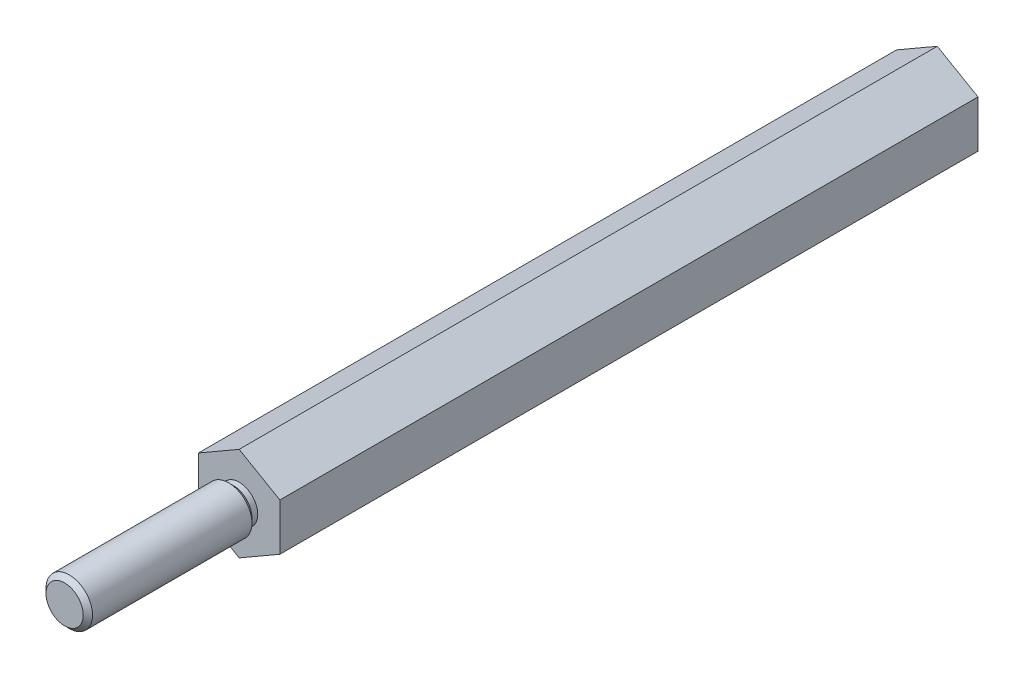
ISO-10303-21;
HEADER;
FILE_DESCRIPTION(('STEP AP214'),'2;1');
FILE_NAME('part.step','',(''),(''),'','','');
FILE_SCHEMA(('AUTOMOTIVE_DESIGN { 1 0 10303 214 1 1 1 1 }'));
ENDSEC;
DATA;
#1=APPLICATION_CONTEXT('core data for automotive mechanical design processes');
#2=APPLICATION_PROTOCOL_DEFINITION('international standard','automotive_design',2000,#1);
#3=PRODUCT_CONTEXT('',#1,'mechanical');
#4=PRODUCT('Part','Part','',(#3));
#5=PRODUCT_RELATED_PRODUCT_CATEGORY('part','',(#4));
#6=PRODUCT_DEFINITION_FORMATION('','',#4);
#7=PRODUCT_DEFINITION_CONTEXT('part definition',#1,'design');
#8=PRODUCT_DEFINITION('design','',#6,#7);
#9=PRODUCT_DEFINITION_SHAPE('','',#8);
#10=(LENGTH_UNIT() NAMED_UNIT(*) SI_UNIT(.MILLI.,.METRE.));
#11=(NAMED_UNIT(*) PLANE_ANGLE_UNIT() SI_UNIT($,.RADIAN.));
#12=(NAMED_UNIT(*) SI_UNIT($,.STERADIAN.) SOLID_ANGLE_UNIT());
#13=UNCERTAINTY_MEASURE_WITH_UNIT(LENGTH_MEASURE(1.E-05),#10,'distance_accuracy_value','');
#14=(GEOMETRIC_REPRESENTATION_CONTEXT(3) GLOBAL_UNCERTAINTY_ASSIGNED_CONTEXT((#13)) GLOBAL_UNIT_ASSIGNED_CONTEXT((#10,
#11,#12)) REPRESENTATION_CONTEXT('',''));
#15=CARTESIAN_POINT('',(0.,0.,0.));
#16=DIRECTION('',(0.,0.,1.));
#17=DIRECTION('',(1.,0.,0.));
#18=AXIS2_PLACEMENT_3D('',#15,#16,#17);
#19=CARTESIAN_POINT('',(0.,4.04145188432737,60.));
#20=DIRECTION('',(0.,0.,1.));
#21=DIRECTION('',(1.,0.,0.));
#22=AXIS2_PLACEMENT_3D('',#19,#20,#21);
#23=PLANE('',#22);
#24=DIRECTION('',(-0.866025403784438,0.5,0.));
#25=VECTOR('',#24,1.);
#26=CARTESIAN_POINT('',(3.49999999999999,2.02072594216368,60.));
#27=LINE('',#26,#25);
#28=CARTESIAN_POINT('',(3.49999999999999,2.02072594216368,60.));
#29=VERTEX_POINT('',#28);
#30=CARTESIAN_POINT('',(0.,4.04145188432737,60.));
#31=VERTEX_POINT('',#30);
#32=EDGE_CURVE('E129',#29,#31,#27,.T.);
#33=ORIENTED_EDGE('',*,*,#32,.T.);
#34=DIRECTION('',(-0.866025403784438,-0.5,0.));
#35=VECTOR('',#34,1.);
#36=CARTESIAN_POINT('',(0.,4.04145188432737,60.));
#37=LINE('',#36,#35);
#38=CARTESIAN_POINT('',(-3.5,2.02072594216368,60.));
#39=VERTEX_POINT('',#38);
#40=EDGE_CURVE('E86',#31,#39,#37,.T.);
#41=ORIENTED_EDGE('',*,*,#40,.T.);
#42=DIRECTION('',(0.,-1.,0.));
#43=VECTOR('',#42,1.);
#44=CARTESIAN_POINT('',(-3.5,2.02072594216368,60.));
#45=LINE('',#44,#43);
#46=CARTESIAN_POINT('',(-3.5,-2.0207259421637,60.));
#47=VERTEX_POINT('',#46);
#48=EDGE_CURVE('E100',#39,#47,#45,.T.);
#49=ORIENTED_EDGE('',*,*,#48,.T.);
#50=DIRECTION('',(0.866025403784438,-0.5,0.));
#51=VECTOR('',#50,1.);
#52=CARTESIAN_POINT('',(-3.5,-2.0207259421637,60.));
#53=LINE('',#52,#51);
#54=CARTESIAN_POINT('',(0.,-4.04145188432739,60.));
#55=VERTEX_POINT('',#54);
#56=EDGE_CURVE('E94',#47,#55,#53,.T.);
#57=ORIENTED_EDGE('',*,*,#56,.T.);
#58=DIRECTION('',(0.866025403784439,0.5,0.));
#59=VECTOR('',#58,1.);
#60=CARTESIAN_POINT('',(0.,-4.04145188432739,60.));
#61=LINE('',#60,#59);
#62=CARTESIAN_POINT('',(3.49999999999999,-2.0207259421637,60.));
#63=VERTEX_POINT('',#62);
#64=EDGE_CURVE('E98',#55,#63,#61,.T.);
#65=ORIENTED_EDGE('',*,*,#64,.T.);
#66=DIRECTION('',(0.,1.,0.));
#67=VECTOR('',#66,1.);
#68=CARTESIAN_POINT('',(3.49999999999999,-2.0207259421637,60.));
#69=LINE('',#68,#67);
#70=EDGE_CURVE('E47',#63,#29,#69,.T.);
#71=ORIENTED_EDGE('',*,*,#70,.T.);
#72=EDGE_LOOP('',(#33,#41,#49,#57,#65,#71));
#73=FACE_BOUND('',#72,.T.);
#74=CARTESIAN_POINT('',(0.,0.,60.));
#75=DIRECTION('',(0.,0.,1.));
#76=DIRECTION('',(1.,0.,0.));
#77=AXIS2_PLACEMENT_3D('',#74,#75,#76);
#78=CIRCLE('',#77,1.6);
#79=CARTESIAN_POINT('',(1.6,0.,60.));
#80=VERTEX_POINT('',#79);
#81=EDGE_CURVE('E196',#80,#80,#78,.T.);
#82=ORIENTED_EDGE('',*,*,#81,.F.);
#83=EDGE_LOOP('',(#82));
#84=FACE_BOUND('',#83,.T.);
#85=ADVANCED_FACE('F30',(#73,#84),#23,.T.);
#86=CARTESIAN_POINT('',(3.49999999999999,2.02072594216368,60.));
#87=DIRECTION('',(-0.5,-0.866025403784438,0.));
#88=DIRECTION('',(0.866025403784438,-0.5,0.));
#89=AXIS2_PLACEMENT_3D('',#86,#87,#88);
#90=PLANE('',#89);
#91=DIRECTION('',(-0.866025403784438,0.5,0.));
#92=VECTOR('',#91,1.);
#93=CARTESIAN_POINT('',(3.49999999999999,2.02072594216368,0.));
#94=LINE('',#93,#92);
#95=CARTESIAN_POINT('',(3.49999999999999,2.02072594216368,0.));
#96=VERTEX_POINT('',#95);
#97=CARTESIAN_POINT('',(0.,4.04145188432737,0.));
#98=VERTEX_POINT('',#97);
#99=EDGE_CURVE('E118',#96,#98,#94,.T.);
#100=ORIENTED_EDGE('',*,*,#99,.T.);
#101=DIRECTION('',(0.,0.,-1.));
#102=VECTOR('',#101,1.);
#103=CARTESIAN_POINT('',(0.,4.04145188432737,60.));
#104=LINE('',#103,#102);
#105=EDGE_CURVE('E136',#31,#98,#104,.T.);
#106=ORIENTED_EDGE('',*,*,#105,.F.);
#107=ORIENTED_EDGE('',*,*,#32,.F.);
#108=DIRECTION('',(0.,0.,-1.));
#109=VECTOR('',#108,1.);
#110=CARTESIAN_POINT('',(3.49999999999999,2.02072594216368,60.));
#111=LINE('',#110,#109);
#112=EDGE_CURVE('E114',#29,#96,#111,.T.);
#113=ORIENTED_EDGE('',*,*,#112,.T.);
#114=EDGE_LOOP('',(#100,#106,#107,#113));
#115=FACE_BOUND('',#114,.T.);
#116=ADVANCED_FACE('F160',(#115),#90,.F.);
#117=CARTESIAN_POINT('',(0.,4.04145188432737,60.));
#118=DIRECTION('',(0.5,-0.866025403784438,0.));
#119=DIRECTION('',(0.866025403784438,0.5,0.));
#120=AXIS2_PLACEMENT_3D('',#117,#118,#119);
#121=PLANE('',#120);
#122=DIRECTION('',(-0.866025403784438,-0.5,0.));
#123=VECTOR('',#122,1.);
#124=CARTESIAN_POINT('',(0.,4.04145188432737,0.));
#125=LINE('',#124,#123);
#126=CARTESIAN_POINT('',(-3.5,2.02072594216368,0.));
#127=VERTEX_POINT('',#126);
#128=EDGE_CURVE('E121',#98,#127,#125,.T.);
#129=ORIENTED_EDGE('',*,*,#128,.T.);
#130=DIRECTION('',(0.,0.,-1.));
#131=VECTOR('',#130,1.);
#132=CARTESIAN_POINT('',(-3.5,2.02072594216368,60.));
#133=LINE('',#132,#131);
#134=EDGE_CURVE('E133',#39,#127,#133,.T.);
#135=ORIENTED_EDGE('',*,*,#134,.F.);
#136=ORIENTED_EDGE('',*,*,#40,.F.);
#137=ORIENTED_EDGE('',*,*,#105,.T.);
#138=EDGE_LOOP('',(#129,#135,#136,#137));
#139=FACE_BOUND('',#138,.T.);
#140=ADVANCED_FACE('F165',(#139),#121,.F.);
#141=CARTESIAN_POINT('',(-3.5,2.02072594216368,60.));
#142=DIRECTION('',(1.,0.,0.));
#143=DIRECTION('',(0.,0.,-1.));
#144=AXIS2_PLACEMENT_3D('',#141,#142,#143);
#145=PLANE('',#144);
#146=DIRECTION('',(0.,-1.,0.));
#147=VECTOR('',#146,1.);
#148=CARTESIAN_POINT('',(-3.5,2.02072594216368,0.));
#149=LINE('',#148,#147);
#150=CARTESIAN_POINT('',(-3.5,-2.0207259421637,0.));
#151=VERTEX_POINT('',#150);
#152=EDGE_CURVE('E124',#127,#151,#149,.T.);
#153=ORIENTED_EDGE('',*,*,#152,.T.);
#154=DIRECTION('',(0.,0.,-1.));
#155=VECTOR('',#154,1.);
#156=CARTESIAN_POINT('',(-3.5,-2.0207259421637,60.));
#157=LINE('',#156,#155);
#158=EDGE_CURVE('E109',#47,#151,#157,.T.);
#159=ORIENTED_EDGE('',*,*,#158,.F.);
#160=ORIENTED_EDGE('',*,*,#48,.F.);
#161=ORIENTED_EDGE('',*,*,#134,.T.);
#162=EDGE_LOOP('',(#153,#159,#160,#161));
#163=FACE_BOUND('',#162,.T.);
#164=ADVANCED_FACE('F181',(#163),#145,.F.);
#165=CARTESIAN_POINT('',(-3.5,-2.0207259421637,60.));
#166=DIRECTION('',(0.5,0.866025403784439,0.));
#167=DIRECTION('',(-0.866025403784439,0.5,0.));
#168=AXIS2_PLACEMENT_3D('',#165,#166,#167);
#169=PLANE('',#168);
#170=DIRECTION('',(0.866025403784438,-0.5,0.));
#171=VECTOR('',#170,1.);
#172=CARTESIAN_POINT('',(-3.5,-2.0207259421637,0.));
#173=LINE('',#172,#171);
#174=CARTESIAN_POINT('',(0.,-4.04145188432739,0.));
#175=VERTEX_POINT('',#174);
#176=EDGE_CURVE('E108',#151,#175,#173,.T.);
#177=ORIENTED_EDGE('',*,*,#176,.T.);
#178=DIRECTION('',(0.,0.,-1.));
#179=VECTOR('',#178,1.);
#180=CARTESIAN_POINT('',(0.,-4.04145188432739,60.));
#181=LINE('',#180,#179);
#182=EDGE_CURVE('E105',#55,#175,#181,.T.);
#183=ORIENTED_EDGE('',*,*,#182,.F.);
#184=ORIENTED_EDGE('',*,*,#56,.F.);
#185=ORIENTED_EDGE('',*,*,#158,.T.);
#186=EDGE_LOOP('',(#177,#183,#184,#185));
#187=FACE_BOUND('',#186,.T.);
#188=ADVANCED_FACE('F106',(#187),#169,.F.);
#189=CARTESIAN_POINT('',(0.,-4.04145188432739,60.));
#190=DIRECTION('',(-0.5,0.866025403784439,0.));
#191=DIRECTION('',(-0.866025403784439,-0.5,0.));
#192=AXIS2_PLACEMENT_3D('',#189,#190,#191);
#193=PLANE('',#192);
#194=DIRECTION('',(0.866025403784439,0.5,0.));
#195=VECTOR('',#194,1.);
#196=CARTESIAN_POINT('',(0.,-4.04145188432739,0.));
#197=LINE('',#196,#195);
#198=CARTESIAN_POINT('',(3.49999999999999,-2.0207259421637,0.));
#199=VERTEX_POINT('',#198);
#200=EDGE_CURVE('E71',#175,#199,#197,.T.);
#201=ORIENTED_EDGE('',*,*,#200,.T.);
#202=DIRECTION('',(0.,0.,-1.));
#203=VECTOR('',#202,1.);
#204=CARTESIAN_POINT('',(3.49999999999999,-2.0207259421637,60.));
#205=LINE('',#204,#203);
#206=EDGE_CURVE('E110',#63,#199,#205,.T.);
#207=ORIENTED_EDGE('',*,*,#206,.F.);
#208=ORIENTED_EDGE('',*,*,#64,.F.);
#209=ORIENTED_EDGE('',*,*,#182,.T.);
#210=EDGE_LOOP('',(#201,#207,#208,#209));
#211=FACE_BOUND('',#210,.T.);
#212=ADVANCED_FACE('F112',(#211),#193,.F.);
#213=CARTESIAN_POINT('',(3.49999999999999,-2.0207259421637,60.));
#214=DIRECTION('',(-1.,0.,0.));
#215=DIRECTION('',(0.,-1.,0.));
#216=AXIS2_PLACEMENT_3D('',#213,#214,#215);
#217=PLANE('',#216);
#218=DIRECTION('',(0.,1.,0.));
#219=VECTOR('',#218,1.);
#220=CARTESIAN_POINT('',(3.49999999999999,-2.0207259421637,0.));
#221=LINE('',#220,#219);
#222=EDGE_CURVE('E77',#199,#96,#221,.T.);
#223=ORIENTED_EDGE('',*,*,#222,.T.);
#224=ORIENTED_EDGE('',*,*,#112,.F.);
#225=ORIENTED_EDGE('',*,*,#70,.F.);
#226=ORIENTED_EDGE('',*,*,#206,.T.);
#227=EDGE_LOOP('',(#223,#224,#225,#226));
#228=FACE_BOUND('',#227,.T.);
#229=ADVANCED_FACE('F173',(#228),#217,.F.);
#230=CARTESIAN_POINT('',(0.,4.04145188432737,0.));
#231=DIRECTION('',(0.,0.,1.));
#232=DIRECTION('',(1.,0.,0.));
#233=AXIS2_PLACEMENT_3D('',#230,#231,#232);
#234=PLANE('',#233);
#235=CARTESIAN_POINT('',(0.,0.,0.));
#236=DIRECTION('',(0.,0.,-1.));
#237=DIRECTION('',(-1.,0.,0.));
#238=AXIS2_PLACEMENT_3D('',#235,#236,#237);
#239=CIRCLE('',#238,1.5);
#240=CARTESIAN_POINT('',(-1.5,0.,0.));
#241=VERTEX_POINT('',#240);
#242=EDGE_CURVE('E206',#241,#241,#239,.T.);
#243=ORIENTED_EDGE('',*,*,#242,.F.);
#244=EDGE_LOOP('',(#243));
#245=FACE_BOUND('',#244,.T.);
#246=ORIENTED_EDGE('',*,*,#99,.F.);
#247=ORIENTED_EDGE('',*,*,#222,.F.);
#248=ORIENTED_EDGE('',*,*,#200,.F.);
#249=ORIENTED_EDGE('',*,*,#176,.F.);
#250=ORIENTED_EDGE('',*,*,#152,.F.);
#251=ORIENTED_EDGE('',*,*,#128,.F.);
#252=EDGE_LOOP('',(#246,#247,#248,#249,#250,#251));
#253=FACE_BOUND('',#252,.T.);
#254=ADVANCED_FACE('F169',(#245,#253),#234,.F.);
#255=CARTESIAN_POINT('',(0.,0.,60.5));
#256=DIRECTION('',(0.,0.,-1.));
#257=DIRECTION('',(-1.,0.,0.));
#258=AXIS2_PLACEMENT_3D('',#255,#256,#257);
#259=CYLINDRICAL_SURFACE('',#258,1.6);
#260=CARTESIAN_POINT('',(0.,0.,60.5));
#261=DIRECTION('',(0.,0.,1.));
#262=DIRECTION('',(1.,0.,0.));
#263=AXIS2_PLACEMENT_3D('',#260,#261,#262);
#264=CIRCLE('',#263,1.6);
#265=CARTESIAN_POINT('',(1.6,0.,60.5));
#266=VERTEX_POINT('',#265);
#267=EDGE_CURVE('E122',#266,#266,#264,.T.);
#268=ORIENTED_EDGE('',*,*,#267,.F.);
#269=EDGE_LOOP('',(#268));
#270=FACE_BOUND('',#269,.T.);
#271=ORIENTED_EDGE('',*,*,#81,.T.);
#272=EDGE_LOOP('',(#271));
#273=FACE_BOUND('',#272,.T.);
#274=ADVANCED_FACE('F172',(#270,#273),#259,.T.);
#275=CARTESIAN_POINT('',(0.,0.,75.));
#276=DIRECTION('',(0.,0.,1.));
#277=DIRECTION('',(1.,0.,0.));
#278=AXIS2_PLACEMENT_3D('',#275,#276,#277);
#279=PLANE('',#278);
#280=CARTESIAN_POINT('',(0.,0.,75.));
#281=DIRECTION('',(0.,0.,1.));
#282=DIRECTION('',(1.,0.,0.));
#283=AXIS2_PLACEMENT_3D('',#280,#281,#282);
#284=CIRCLE('',#283,1.6);
#285=CARTESIAN_POINT('',(1.6,0.,75.));
#286=VERTEX_POINT('',#285);
#287=EDGE_CURVE('E11',#286,#286,#284,.T.);
#288=ORIENTED_EDGE('',*,*,#287,.T.);
#289=EDGE_LOOP('',(#288));
#290=FACE_BOUND('',#289,.T.);
#291=ADVANCED_FACE('F155',(#290),#279,.T.);
#292=CARTESIAN_POINT('',(0.,0.,75.));
#293=DIRECTION('',(0.,0.,-1.));
#294=DIRECTION('',(-1.,0.,0.));
#295=AXIS2_PLACEMENT_3D('',#292,#293,#294);
#296=CYLINDRICAL_SURFACE('',#295,2.);
#297=CARTESIAN_POINT('',(0.,0.,60.9));
#298=DIRECTION('',(0.,0.,1.));
#299=DIRECTION('',(1.,0.,0.));
#300=AXIS2_PLACEMENT_3D('',#297,#298,#299);
#301=CIRCLE('',#300,2.);
#302=CARTESIAN_POINT('',(2.,0.,60.9));
#303=VERTEX_POINT('',#302);
#304=EDGE_CURVE('E39',#303,#303,#301,.T.);
#305=ORIENTED_EDGE('',*,*,#304,.T.);
#306=EDGE_LOOP('',(#305));
#307=FACE_BOUND('',#306,.T.);
#308=CARTESIAN_POINT('',(0.,0.,74.6));
#309=DIRECTION('',(0.,0.,1.));
#310=DIRECTION('',(1.,0.,0.));
#311=AXIS2_PLACEMENT_3D('',#308,#309,#310);
#312=CIRCLE('',#311,2.);
#313=CARTESIAN_POINT('',(2.,0.,74.6));
#314=VERTEX_POINT('',#313);
#315=EDGE_CURVE('E138',#314,#314,#312,.F.);
#316=ORIENTED_EDGE('',*,*,#315,.T.);
#317=EDGE_LOOP('',(#316));
#318=FACE_BOUND('',#317,.T.);
#319=ADVANCED_FACE('F143',(#307,#318),#296,.T.);
#320=CARTESIAN_POINT('',(0.,0.,60.9));
#321=DIRECTION('',(0.,0.,1.));
#322=DIRECTION('',(1.,0.,0.));
#323=AXIS2_PLACEMENT_3D('',#320,#321,#322);
#324=CONICAL_SURFACE('',#323,2.,0.785398163397443);
#325=ORIENTED_EDGE('',*,*,#267,.T.);
#326=EDGE_LOOP('',(#325));
#327=FACE_BOUND('',#326,.T.);
#328=ORIENTED_EDGE('',*,*,#304,.F.);
#329=EDGE_LOOP('',(#328));
#330=FACE_BOUND('',#329,.T.);
#331=ADVANCED_FACE('F146',(#327,#330),#324,.T.);
#332=CARTESIAN_POINT('',(0.,0.,75.));
#333=DIRECTION('',(0.,0.,-1.));
#334=DIRECTION('',(-1.,0.,0.));
#335=AXIS2_PLACEMENT_3D('',#332,#333,#334);
#336=CONICAL_SURFACE('',#335,1.6,0.785398163397449);
#337=ORIENTED_EDGE('',*,*,#315,.F.);
#338=EDGE_LOOP('',(#337));
#339=FACE_BOUND('',#338,.T.);
#340=ORIENTED_EDGE('',*,*,#287,.F.);
#341=EDGE_LOOP('',(#340));
#342=FACE_BOUND('',#341,.T.);
#343=ADVANCED_FACE('F32',(#339,#342),#336,.T.);
#344=CARTESIAN_POINT('',(0.,0.,8.));
#345=DIRECTION('',(0.,0.,-1.));
#346=DIRECTION('',(-1.,0.,0.));
#347=AXIS2_PLACEMENT_3D('',#344,#345,#346);
#348=CONICAL_SURFACE('',#347,1.1,1.02974425867665);
#349=CARTESIAN_POINT('',(0.,0.,8.66094668093032));
#350=VERTEX_POINT('',#349);
#351=VERTEX_LOOP('',#350);
#352=FACE_BOUND('',#351,.T.);
#353=CARTESIAN_POINT('',(0.,0.,8.));
#354=DIRECTION('',(0.,0.,-1.));
#355=DIRECTION('',(-1.,0.,0.));
#356=AXIS2_PLACEMENT_3D('',#353,#354,#355);
#357=CIRCLE('',#356,1.1);
#358=CARTESIAN_POINT('',(-1.1,0.,8.));
#359=VERTEX_POINT('',#358);
#360=EDGE_CURVE('E199',#359,#359,#357,.T.);
#361=ORIENTED_EDGE('',*,*,#360,.T.);
#362=EDGE_LOOP('',(#361));
#363=FACE_BOUND('',#362,.T.);
#364=ADVANCED_FACE('F153',(#352,#363),#348,.F.);
#365=CARTESIAN_POINT('',(0.,0.,0.));
#366=DIRECTION('',(0.,0.,-1.));
#367=DIRECTION('',(-1.,0.,0.));
#368=AXIS2_PLACEMENT_3D('',#365,#366,#367);
#369=CYLINDRICAL_SURFACE('',#368,1.1);
#370=ORIENTED_EDGE('',*,*,#360,.F.);
#371=EDGE_LOOP('',(#370));
#372=FACE_BOUND('',#371,.T.);
#373=CARTESIAN_POINT('',(0.,0.,0.400000000000001));
#374=DIRECTION('',(0.,0.,-1.));
#375=DIRECTION('',(-1.,0.,0.));
#376=AXIS2_PLACEMENT_3D('',#373,#374,#375);
#377=CIRCLE('',#376,1.1);
#378=CARTESIAN_POINT('',(-1.1,0.,0.400000000000001));
#379=VERTEX_POINT('',#378);
#380=EDGE_CURVE('E203',#379,#379,#377,.T.);
#381=ORIENTED_EDGE('',*,*,#380,.T.);
#382=EDGE_LOOP('',(#381));
#383=FACE_BOUND('',#382,.T.);
#384=ADVANCED_FACE('F212',(#372,#383),#369,.F.);
#385=CARTESIAN_POINT('',(0.,0.,0.));
#386=DIRECTION('',(0.,0.,-1.));
#387=DIRECTION('',(-1.,0.,0.));
#388=AXIS2_PLACEMENT_3D('',#385,#386,#387);
#389=CONICAL_SURFACE('',#388,1.5,0.785398163397449);
#390=ORIENTED_EDGE('',*,*,#380,.F.);
#391=EDGE_LOOP('',(#390));
#392=FACE_BOUND('',#391,.T.);
#393=ORIENTED_EDGE('',*,*,#242,.T.);
#394=EDGE_LOOP('',(#393));
#395=FACE_BOUND('',#394,.T.);
#396=ADVANCED_FACE('F210',(#392,#395),#389,.F.);
#397=CLOSED_SHELL('',(#85,#116,#140,#164,#188,#212,#229,#254,#274,#291,#319,#331,#343,#364,#384,#396));
#398=MANIFOLD_SOLID_BREP('B2',#397);
#399=ADVANCED_BREP_SHAPE_REPRESENTATION('',(#18,#398),#14);
#400=SHAPE_DEFINITION_REPRESENTATION(#9,#399);
ENDSEC;
END-ISO-10303-21;
